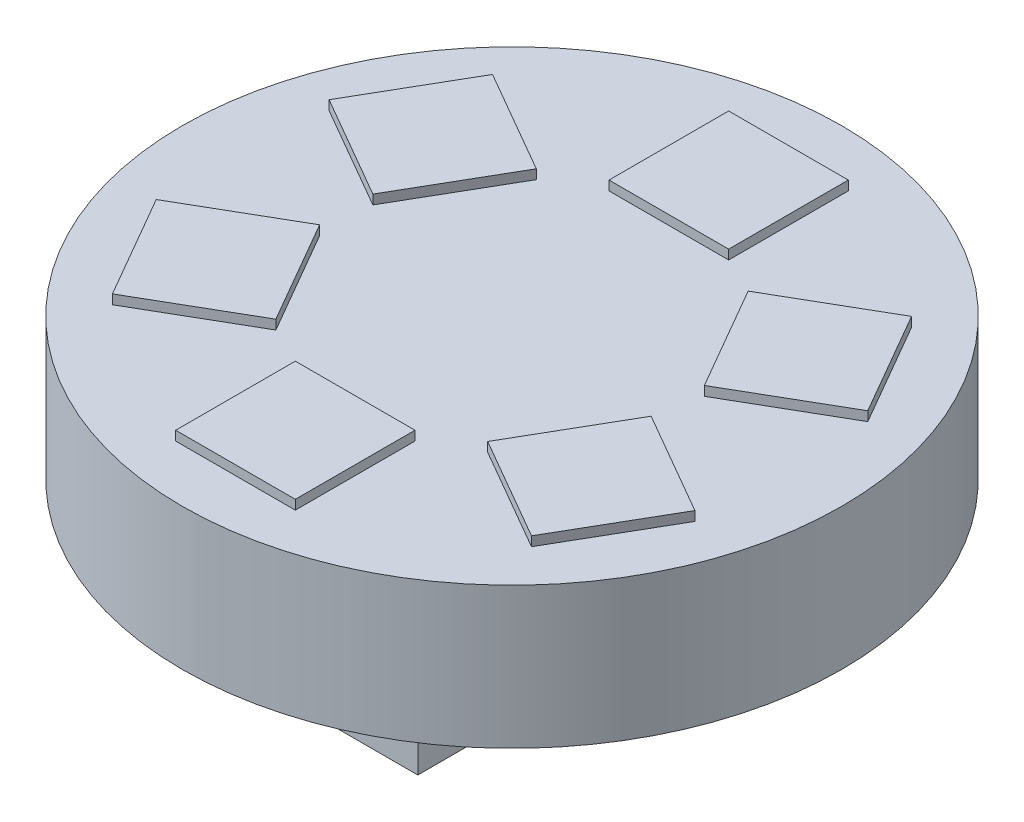
ISO-10303-21;
HEADER;
FILE_DESCRIPTION(('STEP AP214'),'2;1');
FILE_NAME('part.step','',(''),(''),'','','');
FILE_SCHEMA(('AUTOMOTIVE_DESIGN { 1 0 10303 214 1 1 1 1 }'));
ENDSEC;
DATA;
#1=APPLICATION_CONTEXT('core data for automotive mechanical design processes');
#2=APPLICATION_PROTOCOL_DEFINITION('international standard','automotive_design',2000,#1);
#3=PRODUCT_CONTEXT('',#1,'mechanical');
#4=PRODUCT('Part','Part','',(#3));
#5=PRODUCT_RELATED_PRODUCT_CATEGORY('part','',(#4));
#6=PRODUCT_DEFINITION_FORMATION('','',#4);
#7=PRODUCT_DEFINITION_CONTEXT('part definition',#1,'design');
#8=PRODUCT_DEFINITION('design','',#6,#7);
#9=PRODUCT_DEFINITION_SHAPE('','',#8);
#10=(LENGTH_UNIT() NAMED_UNIT(*) SI_UNIT(.MILLI.,.METRE.));
#11=(NAMED_UNIT(*) PLANE_ANGLE_UNIT() SI_UNIT($,.RADIAN.));
#12=(NAMED_UNIT(*) SI_UNIT($,.STERADIAN.) SOLID_ANGLE_UNIT());
#13=UNCERTAINTY_MEASURE_WITH_UNIT(LENGTH_MEASURE(1.E-05),#10,'distance_accuracy_value','');
#14=(GEOMETRIC_REPRESENTATION_CONTEXT(3) GLOBAL_UNCERTAINTY_ASSIGNED_CONTEXT((#13)) GLOBAL_UNIT_ASSIGNED_CONTEXT((#10,
#11,#12)) REPRESENTATION_CONTEXT('',''));
#15=CARTESIAN_POINT('',(0.,0.,0.));
#16=DIRECTION('',(0.,0.,1.));
#17=DIRECTION('',(1.,0.,0.));
#18=AXIS2_PLACEMENT_3D('',#15,#16,#17);
#19=CARTESIAN_POINT('',(0.,1.5,0.));
#20=DIRECTION('',(0.,1.,0.));
#21=DIRECTION('',(0.,0.,1.));
#22=AXIS2_PLACEMENT_3D('',#19,#20,#21);
#23=PLANE('',#22);
#24=DIRECTION('',(0.499999999999999,0.,-0.866025403784439));
#25=VECTOR('',#24,1.);
#26=CARTESIAN_POINT('',(-2.85928456010733,1.5,-0.917573868596879));
#27=LINE('',#26,#25);
#28=CARTESIAN_POINT('',(-2.85928456010733,1.5,-0.917573868596879));
#29=VERTEX_POINT('',#28);
#30=CARTESIAN_POINT('',(-2.22428456010733,1.5,-2.01742613140312));
#31=VERTEX_POINT('',#30);
#32=EDGE_CURVE('E223',#29,#31,#27,.T.);
#33=ORIENTED_EDGE('',*,*,#32,.T.);
#34=DIRECTION('',(0.866025403784439,0.,0.499999999999999));
#35=VECTOR('',#34,1.);
#36=CARTESIAN_POINT('',(-2.22428456010733,1.5,-2.01742613140312));
#37=LINE('',#36,#35);
#38=CARTESIAN_POINT('',(-1.12443229730109,1.5,-1.38242613140312));
#39=VERTEX_POINT('',#38);
#40=EDGE_CURVE('E227',#31,#39,#37,.T.);
#41=ORIENTED_EDGE('',*,*,#40,.T.);
#42=DIRECTION('',(0.499999999999999,0.,-0.866025403784439));
#43=VECTOR('',#42,1.);
#44=CARTESIAN_POINT('',(-1.75943229730109,1.5,-0.28257386859688));
#45=LINE('',#44,#43);
#46=CARTESIAN_POINT('',(-1.75943229730109,1.5,-0.28257386859688));
#47=VERTEX_POINT('',#46);
#48=EDGE_CURVE('E62',#47,#39,#45,.T.);
#49=ORIENTED_EDGE('',*,*,#48,.F.);
#50=DIRECTION('',(0.866025403784439,0.,0.499999999999999));
#51=VECTOR('',#50,1.);
#52=CARTESIAN_POINT('',(-2.85928456010733,1.5,-0.917573868596879));
#53=LINE('',#52,#51);
#54=EDGE_CURVE('E57',#29,#47,#53,.T.);
#55=ORIENTED_EDGE('',*,*,#54,.F.);
#56=EDGE_LOOP('',(#33,#41,#49,#55));
#57=FACE_BOUND('',#56,.T.);
#58=DIRECTION('',(0.,0.,1.));
#59=VECTOR('',#58,1.);
#60=CARTESIAN_POINT('',(0.635,1.5,0.));
#61=LINE('',#60,#59);
#62=CARTESIAN_POINT('',(0.635,1.5,-2.935));
#63=VERTEX_POINT('',#62);
#64=CARTESIAN_POINT('',(0.635,1.5,-1.665));
#65=VERTEX_POINT('',#64);
#66=EDGE_CURVE('E429',#63,#65,#61,.T.);
#67=ORIENTED_EDGE('',*,*,#66,.T.);
#68=DIRECTION('',(1.,0.,0.));
#69=VECTOR('',#68,1.);
#70=CARTESIAN_POINT('',(0.,1.5,-1.665));
#71=LINE('',#70,#69);
#72=CARTESIAN_POINT('',(-0.635,1.5,-1.665));
#73=VERTEX_POINT('',#72);
#74=EDGE_CURVE('E448',#73,#65,#71,.T.);
#75=ORIENTED_EDGE('',*,*,#74,.F.);
#76=DIRECTION('',(0.,0.,1.));
#77=VECTOR('',#76,1.);
#78=CARTESIAN_POINT('',(-0.635,1.5,0.));
#79=LINE('',#78,#77);
#80=CARTESIAN_POINT('',(-0.635,1.5,-2.935));
#81=VERTEX_POINT('',#80);
#82=EDGE_CURVE('E466',#81,#73,#79,.T.);
#83=ORIENTED_EDGE('',*,*,#82,.F.);
#84=DIRECTION('',(1.,0.,0.));
#85=VECTOR('',#84,1.);
#86=CARTESIAN_POINT('',(0.,1.5,-2.935));
#87=LINE('',#86,#85);
#88=EDGE_CURVE('E462',#81,#63,#87,.T.);
#89=ORIENTED_EDGE('',*,*,#88,.T.);
#90=EDGE_LOOP('',(#67,#75,#83,#89));
#91=FACE_BOUND('',#90,.T.);
#92=CARTESIAN_POINT('',(0.,1.5,0.));
#93=DIRECTION('',(0.,1.,0.));
#94=DIRECTION('',(0.,0.,1.));
#95=AXIS2_PLACEMENT_3D('',#92,#93,#94);
#96=CIRCLE('',#95,3.5);
#97=CARTESIAN_POINT('',(0.,1.5,3.5));
#98=VERTEX_POINT('',#97);
#99=EDGE_CURVE('E11',#98,#98,#96,.T.);
#100=ORIENTED_EDGE('',*,*,#99,.T.);
#101=EDGE_LOOP('',(#100));
#102=FACE_BOUND('',#101,.T.);
#103=DIRECTION('',(0.5,0.,0.866025403784439));
#104=VECTOR('',#103,1.);
#105=CARTESIAN_POINT('',(1.44193229730109,1.5,-0.8325));
#106=LINE('',#105,#104);
#107=CARTESIAN_POINT('',(1.12443229730109,1.5,-1.38242613140312));
#108=VERTEX_POINT('',#107);
#109=CARTESIAN_POINT('',(1.75943229730109,1.5,-0.282573868596882));
#110=VERTEX_POINT('',#109);
#111=EDGE_CURVE('E421',#108,#110,#106,.T.);
#112=ORIENTED_EDGE('',*,*,#111,.F.);
#113=DIRECTION('',(-0.866025403784438,0.,0.5));
#114=VECTOR('',#113,1.);
#115=CARTESIAN_POINT('',(-0.3175,1.5,-0.549926131403118));
#116=LINE('',#115,#114);
#117=CARTESIAN_POINT('',(2.22428456010733,1.5,-2.01742613140312));
#118=VERTEX_POINT('',#117);
#119=EDGE_CURVE('E425',#118,#108,#116,.T.);
#120=ORIENTED_EDGE('',*,*,#119,.F.);
#121=DIRECTION('',(0.5,0.,0.866025403784439));
#122=VECTOR('',#121,1.);
#123=CARTESIAN_POINT('',(2.54178456010733,1.5,-1.4675));
#124=LINE('',#123,#122);
#125=CARTESIAN_POINT('',(2.85928456010733,1.5,-0.917573868596882));
#126=VERTEX_POINT('',#125);
#127=EDGE_CURVE('E414',#118,#126,#124,.T.);
#128=ORIENTED_EDGE('',*,*,#127,.T.);
#129=DIRECTION('',(-0.866025403784439,0.,0.5));
#130=VECTOR('',#129,1.);
#131=CARTESIAN_POINT('',(0.3175,1.5,0.549926131403118));
#132=LINE('',#131,#130);
#133=EDGE_CURVE('E417',#126,#110,#132,.T.);
#134=ORIENTED_EDGE('',*,*,#133,.T.);
#135=EDGE_LOOP('',(#112,#120,#128,#134));
#136=FACE_BOUND('',#135,.T.);
#137=DIRECTION('',(-0.5,0.,0.866025403784439));
#138=VECTOR('',#137,1.);
#139=CARTESIAN_POINT('',(1.44193229730109,1.5,0.8325));
#140=LINE('',#139,#138);
#141=CARTESIAN_POINT('',(1.75943229730109,1.5,0.282573868596881));
#142=VERTEX_POINT('',#141);
#143=CARTESIAN_POINT('',(1.12443229730109,1.5,1.38242613140312));
#144=VERTEX_POINT('',#143);
#145=EDGE_CURVE('E376',#142,#144,#140,.T.);
#146=ORIENTED_EDGE('',*,*,#145,.F.);
#147=DIRECTION('',(-0.866025403784439,0.,-0.5));
#148=VECTOR('',#147,1.);
#149=CARTESIAN_POINT('',(0.3175,1.5,-0.549926131403119));
#150=LINE('',#149,#148);
#151=CARTESIAN_POINT('',(2.85928456010733,1.5,0.917573868596881));
#152=VERTEX_POINT('',#151);
#153=EDGE_CURVE('E380',#152,#142,#150,.T.);
#154=ORIENTED_EDGE('',*,*,#153,.F.);
#155=DIRECTION('',(-0.5,0.,0.866025403784439));
#156=VECTOR('',#155,1.);
#157=CARTESIAN_POINT('',(2.54178456010733,1.5,1.4675));
#158=LINE('',#157,#156);
#159=CARTESIAN_POINT('',(2.22428456010733,1.5,2.01742613140312));
#160=VERTEX_POINT('',#159);
#161=EDGE_CURVE('E369',#152,#160,#158,.T.);
#162=ORIENTED_EDGE('',*,*,#161,.T.);
#163=DIRECTION('',(-0.866025403784439,0.,-0.5));
#164=VECTOR('',#163,1.);
#165=CARTESIAN_POINT('',(-0.3175,1.5,0.549926131403119));
#166=LINE('',#165,#164);
#167=EDGE_CURVE('E372',#160,#144,#166,.T.);
#168=ORIENTED_EDGE('',*,*,#167,.T.);
#169=EDGE_LOOP('',(#146,#154,#162,#168));
#170=FACE_BOUND('',#169,.T.);
#171=DIRECTION('',(-1.,0.,0.));
#172=VECTOR('',#171,1.);
#173=CARTESIAN_POINT('',(0.,1.5,1.665));
#174=LINE('',#173,#172);
#175=CARTESIAN_POINT('',(0.635,1.5,1.665));
#176=VERTEX_POINT('',#175);
#177=CARTESIAN_POINT('',(-0.635,1.5,1.665));
#178=VERTEX_POINT('',#177);
#179=EDGE_CURVE('E331',#176,#178,#174,.T.);
#180=ORIENTED_EDGE('',*,*,#179,.F.);
#181=DIRECTION('',(0.,0.,-1.));
#182=VECTOR('',#181,1.);
#183=CARTESIAN_POINT('',(0.635,1.5,0.));
#184=LINE('',#183,#182);
#185=CARTESIAN_POINT('',(0.635000000000001,1.5,2.935));
#186=VERTEX_POINT('',#185);
#187=EDGE_CURVE('E335',#186,#176,#184,.T.);
#188=ORIENTED_EDGE('',*,*,#187,.F.);
#189=DIRECTION('',(-1.,0.,0.));
#190=VECTOR('',#189,1.);
#191=CARTESIAN_POINT('',(0.,1.5,2.935));
#192=LINE('',#191,#190);
#193=CARTESIAN_POINT('',(-0.635,1.5,2.935));
#194=VERTEX_POINT('',#193);
#195=EDGE_CURVE('E324',#186,#194,#192,.T.);
#196=ORIENTED_EDGE('',*,*,#195,.T.);
#197=DIRECTION('',(0.,0.,-1.));
#198=VECTOR('',#197,1.);
#199=CARTESIAN_POINT('',(-0.635,1.5,0.));
#200=LINE('',#199,#198);
#201=EDGE_CURVE('E327',#194,#178,#200,.T.);
#202=ORIENTED_EDGE('',*,*,#201,.T.);
#203=EDGE_LOOP('',(#180,#188,#196,#202));
#204=FACE_BOUND('',#203,.T.);
#205=DIRECTION('',(-0.5,0.,-0.866025403784438));
#206=VECTOR('',#205,1.);
#207=CARTESIAN_POINT('',(-1.44193229730109,1.5,0.832500000000001));
#208=LINE('',#207,#206);
#209=CARTESIAN_POINT('',(-1.12443229730109,1.5,1.38242613140312));
#210=VERTEX_POINT('',#209);
#211=CARTESIAN_POINT('',(-1.75943229730109,1.5,0.282573868596883));
#212=VERTEX_POINT('',#211);
#213=EDGE_CURVE('E286',#210,#212,#208,.T.);
#214=ORIENTED_EDGE('',*,*,#213,.F.);
#215=DIRECTION('',(0.866025403784438,0.,-0.500000000000001));
#216=VECTOR('',#215,1.);
#217=CARTESIAN_POINT('',(0.3175,1.5,0.549926131403118));
#218=LINE('',#217,#216);
#219=CARTESIAN_POINT('',(-2.22428456010733,1.5,2.01742613140312));
#220=VERTEX_POINT('',#219);
#221=EDGE_CURVE('E290',#220,#210,#218,.T.);
#222=ORIENTED_EDGE('',*,*,#221,.F.);
#223=DIRECTION('',(-0.5,0.,-0.866025403784439));
#224=VECTOR('',#223,1.);
#225=CARTESIAN_POINT('',(-2.54178456010733,1.5,1.4675));
#226=LINE('',#225,#224);
#227=CARTESIAN_POINT('',(-2.85928456010733,1.5,0.917573868596883));
#228=VERTEX_POINT('',#227);
#229=EDGE_CURVE('E279',#220,#228,#226,.T.);
#230=ORIENTED_EDGE('',*,*,#229,.T.);
#231=DIRECTION('',(0.866025403784438,0.,-0.5));
#232=VECTOR('',#231,1.);
#233=CARTESIAN_POINT('',(-0.3175,1.5,-0.549926131403118));
#234=LINE('',#233,#232);
#235=EDGE_CURVE('E282',#228,#212,#234,.T.);
#236=ORIENTED_EDGE('',*,*,#235,.T.);
#237=EDGE_LOOP('',(#214,#222,#230,#236));
#238=FACE_BOUND('',#237,.T.);
#239=ADVANCED_FACE('F41',(#57,#91,#102,#136,#170,#204,#238),#23,.T.);
#240=CARTESIAN_POINT('',(0.,0.,0.));
#241=DIRECTION('',(0.,1.,0.));
#242=DIRECTION('',(0.,0.,1.));
#243=AXIS2_PLACEMENT_3D('',#240,#241,#242);
#244=PLANE('',#243);
#245=CARTESIAN_POINT('',(0.,0.,0.));
#246=DIRECTION('',(0.,1.,0.));
#247=DIRECTION('',(0.,0.,1.));
#248=AXIS2_PLACEMENT_3D('',#245,#246,#247);
#249=CIRCLE('',#248,3.5);
#250=CARTESIAN_POINT('',(0.,0.,3.5));
#251=VERTEX_POINT('',#250);
#252=EDGE_CURVE('E45',#251,#251,#249,.T.);
#253=ORIENTED_EDGE('',*,*,#252,.F.);
#254=EDGE_LOOP('',(#253));
#255=FACE_BOUND('',#254,.T.);
#256=DIRECTION('',(0.,0.,1.));
#257=VECTOR('',#256,1.);
#258=CARTESIAN_POINT('',(1.22,0.,0.));
#259=LINE('',#258,#257);
#260=CARTESIAN_POINT('',(1.22,0.,-2.22));
#261=VERTEX_POINT('',#260);
#262=CARTESIAN_POINT('',(1.22,0.,2.22));
#263=VERTEX_POINT('',#262);
#264=EDGE_CURVE('E484',#261,#263,#259,.T.);
#265=ORIENTED_EDGE('',*,*,#264,.F.);
#266=DIRECTION('',(1.,0.,0.));
#267=VECTOR('',#266,1.);
#268=CARTESIAN_POINT('',(0.,0.,-2.22));
#269=LINE('',#268,#267);
#270=CARTESIAN_POINT('',(-1.22,0.,-2.22));
#271=VERTEX_POINT('',#270);
#272=EDGE_CURVE('E503',#271,#261,#269,.T.);
#273=ORIENTED_EDGE('',*,*,#272,.F.);
#274=DIRECTION('',(0.,0.,1.));
#275=VECTOR('',#274,1.);
#276=CARTESIAN_POINT('',(-1.22,0.,0.));
#277=LINE('',#276,#275);
#278=CARTESIAN_POINT('',(-1.22,0.,2.22));
#279=VERTEX_POINT('',#278);
#280=EDGE_CURVE('E506',#271,#279,#277,.T.);
#281=ORIENTED_EDGE('',*,*,#280,.T.);
#282=DIRECTION('',(1.,0.,0.));
#283=VECTOR('',#282,1.);
#284=CARTESIAN_POINT('',(0.,0.,2.22));
#285=LINE('',#284,#283);
#286=EDGE_CURVE('E489',#279,#263,#285,.T.);
#287=ORIENTED_EDGE('',*,*,#286,.T.);
#288=EDGE_LOOP('',(#265,#273,#281,#287));
#289=FACE_BOUND('',#288,.T.);
#290=ADVANCED_FACE('F535',(#255,#289),#244,.F.);
#291=CARTESIAN_POINT('',(0.,1.5,0.));
#292=DIRECTION('',(0.,-1.,0.));
#293=DIRECTION('',(0.,0.,-1.));
#294=AXIS2_PLACEMENT_3D('',#291,#292,#293);
#295=CYLINDRICAL_SURFACE('',#294,3.5);
#296=ORIENTED_EDGE('',*,*,#99,.F.);
#297=EDGE_LOOP('',(#296));
#298=FACE_BOUND('',#297,.T.);
#299=ORIENTED_EDGE('',*,*,#252,.T.);
#300=EDGE_LOOP('',(#299));
#301=FACE_BOUND('',#300,.T.);
#302=ADVANCED_FACE('F43',(#298,#301),#295,.T.);
#303=CARTESIAN_POINT('',(1.22,-1.,0.));
#304=DIRECTION('',(-1.,0.,0.));
#305=DIRECTION('',(0.,0.,1.));
#306=AXIS2_PLACEMENT_3D('',#303,#304,#305);
#307=PLANE('',#306);
#308=ORIENTED_EDGE('',*,*,#264,.T.);
#309=DIRECTION('',(0.,1.,0.));
#310=VECTOR('',#309,1.);
#311=CARTESIAN_POINT('',(1.22,-1.,2.22));
#312=LINE('',#311,#310);
#313=CARTESIAN_POINT('',(1.22,-1.,2.22));
#314=VERTEX_POINT('',#313);
#315=EDGE_CURVE('E513',#314,#263,#312,.T.);
#316=ORIENTED_EDGE('',*,*,#315,.F.);
#317=DIRECTION('',(0.,0.,1.));
#318=VECTOR('',#317,1.);
#319=CARTESIAN_POINT('',(1.22,-1.,0.));
#320=LINE('',#319,#318);
#321=CARTESIAN_POINT('',(1.22,-1.,-2.22));
#322=VERTEX_POINT('',#321);
#323=EDGE_CURVE('E485',#322,#314,#320,.T.);
#324=ORIENTED_EDGE('',*,*,#323,.F.);
#325=DIRECTION('',(0.,1.,0.));
#326=VECTOR('',#325,1.);
#327=CARTESIAN_POINT('',(1.22,-1.,-2.22));
#328=LINE('',#327,#326);
#329=EDGE_CURVE('E500',#322,#261,#328,.T.);
#330=ORIENTED_EDGE('',*,*,#329,.T.);
#331=EDGE_LOOP('',(#308,#316,#324,#330));
#332=FACE_BOUND('',#331,.T.);
#333=ADVANCED_FACE('F529',(#332),#307,.F.);
#334=CARTESIAN_POINT('',(0.,-1.,2.22));
#335=DIRECTION('',(0.,0.,1.));
#336=DIRECTION('',(1.,0.,0.));
#337=AXIS2_PLACEMENT_3D('',#334,#335,#336);
#338=PLANE('',#337);
#339=ORIENTED_EDGE('',*,*,#286,.F.);
#340=DIRECTION('',(0.,1.,0.));
#341=VECTOR('',#340,1.);
#342=CARTESIAN_POINT('',(-1.22,-1.,2.22));
#343=LINE('',#342,#341);
#344=CARTESIAN_POINT('',(-1.22,-1.,2.22));
#345=VERTEX_POINT('',#344);
#346=EDGE_CURVE('E517',#345,#279,#343,.T.);
#347=ORIENTED_EDGE('',*,*,#346,.F.);
#348=DIRECTION('',(1.,0.,0.));
#349=VECTOR('',#348,1.);
#350=CARTESIAN_POINT('',(0.,-1.,2.22));
#351=LINE('',#350,#349);
#352=EDGE_CURVE('E496',#345,#314,#351,.T.);
#353=ORIENTED_EDGE('',*,*,#352,.T.);
#354=ORIENTED_EDGE('',*,*,#315,.T.);
#355=EDGE_LOOP('',(#339,#347,#353,#354));
#356=FACE_BOUND('',#355,.T.);
#357=ADVANCED_FACE('F539',(#356),#338,.T.);
#358=CARTESIAN_POINT('',(-1.22,-1.,0.));
#359=DIRECTION('',(-1.,0.,0.));
#360=DIRECTION('',(0.,0.,1.));
#361=AXIS2_PLACEMENT_3D('',#358,#359,#360);
#362=PLANE('',#361);
#363=ORIENTED_EDGE('',*,*,#280,.F.);
#364=DIRECTION('',(0.,1.,0.));
#365=VECTOR('',#364,1.);
#366=CARTESIAN_POINT('',(-1.22,-1.,-2.22));
#367=LINE('',#366,#365);
#368=CARTESIAN_POINT('',(-1.22,-1.,-2.22));
#369=VERTEX_POINT('',#368);
#370=EDGE_CURVE('E520',#369,#271,#367,.T.);
#371=ORIENTED_EDGE('',*,*,#370,.F.);
#372=DIRECTION('',(0.,0.,1.));
#373=VECTOR('',#372,1.);
#374=CARTESIAN_POINT('',(-1.22,-1.,0.));
#375=LINE('',#374,#373);
#376=EDGE_CURVE('E492',#369,#345,#375,.T.);
#377=ORIENTED_EDGE('',*,*,#376,.T.);
#378=ORIENTED_EDGE('',*,*,#346,.T.);
#379=EDGE_LOOP('',(#363,#371,#377,#378));
#380=FACE_BOUND('',#379,.T.);
#381=ADVANCED_FACE('F546',(#380),#362,.T.);
#382=CARTESIAN_POINT('',(0.,-1.,-2.22));
#383=DIRECTION('',(0.,0.,1.));
#384=DIRECTION('',(1.,0.,0.));
#385=AXIS2_PLACEMENT_3D('',#382,#383,#384);
#386=PLANE('',#385);
#387=ORIENTED_EDGE('',*,*,#272,.T.);
#388=ORIENTED_EDGE('',*,*,#329,.F.);
#389=DIRECTION('',(1.,0.,0.));
#390=VECTOR('',#389,1.);
#391=CARTESIAN_POINT('',(0.,-1.,-2.22));
#392=LINE('',#391,#390);
#393=EDGE_CURVE('E488',#369,#322,#392,.T.);
#394=ORIENTED_EDGE('',*,*,#393,.F.);
#395=ORIENTED_EDGE('',*,*,#370,.T.);
#396=EDGE_LOOP('',(#387,#388,#394,#395));
#397=FACE_BOUND('',#396,.T.);
#398=ADVANCED_FACE('F544',(#397),#386,.F.);
#399=CARTESIAN_POINT('',(0.,-1.,0.));
#400=DIRECTION('',(0.,1.,0.));
#401=DIRECTION('',(0.,0.,1.));
#402=AXIS2_PLACEMENT_3D('',#399,#400,#401);
#403=PLANE('',#402);
#404=ORIENTED_EDGE('',*,*,#323,.T.);
#405=ORIENTED_EDGE('',*,*,#352,.F.);
#406=ORIENTED_EDGE('',*,*,#376,.F.);
#407=ORIENTED_EDGE('',*,*,#393,.T.);
#408=EDGE_LOOP('',(#404,#405,#406,#407));
#409=FACE_BOUND('',#408,.T.);
#410=ADVANCED_FACE('F543',(#409),#403,.F.);
#411=CARTESIAN_POINT('',(0.635,1.6,0.));
#412=DIRECTION('',(1.,0.,0.));
#413=DIRECTION('',(0.,0.,-1.));
#414=AXIS2_PLACEMENT_3D('',#411,#412,#413);
#415=PLANE('',#414);
#416=ORIENTED_EDGE('',*,*,#66,.F.);
#417=DIRECTION('',(0.,-1.,0.));
#418=VECTOR('',#417,1.);
#419=CARTESIAN_POINT('',(0.635,1.6,-2.935));
#420=LINE('',#419,#418);
#421=CARTESIAN_POINT('',(0.635,1.6,-2.935));
#422=VERTEX_POINT('',#421);
#423=EDGE_CURVE('E481',#422,#63,#420,.T.);
#424=ORIENTED_EDGE('',*,*,#423,.F.);
#425=DIRECTION('',(0.,0.,1.));
#426=VECTOR('',#425,1.);
#427=CARTESIAN_POINT('',(0.635,1.6,0.));
#428=LINE('',#427,#426);
#429=CARTESIAN_POINT('',(0.635,1.6,-1.665));
#430=VERTEX_POINT('',#429);
#431=EDGE_CURVE('E443',#422,#430,#428,.T.);
#432=ORIENTED_EDGE('',*,*,#431,.T.);
#433=DIRECTION('',(0.,-1.,0.));
#434=VECTOR('',#433,1.);
#435=CARTESIAN_POINT('',(0.635,1.6,-1.665));
#436=LINE('',#435,#434);
#437=EDGE_CURVE('E458',#430,#65,#436,.T.);
#438=ORIENTED_EDGE('',*,*,#437,.T.);
#439=EDGE_LOOP('',(#416,#424,#432,#438));
#440=FACE_BOUND('',#439,.T.);
#441=ADVANCED_FACE('F682',(#440),#415,.T.);
#442=CARTESIAN_POINT('',(0.,1.6,-2.935));
#443=DIRECTION('',(0.,0.,-1.));
#444=DIRECTION('',(-1.,0.,0.));
#445=AXIS2_PLACEMENT_3D('',#442,#443,#444);
#446=PLANE('',#445);
#447=ORIENTED_EDGE('',*,*,#88,.F.);
#448=DIRECTION('',(0.,-1.,0.));
#449=VECTOR('',#448,1.);
#450=CARTESIAN_POINT('',(-0.635,1.6,-2.935));
#451=LINE('',#450,#449);
#452=CARTESIAN_POINT('',(-0.635,1.6,-2.935));
#453=VERTEX_POINT('',#452);
#454=EDGE_CURVE('E478',#453,#81,#451,.T.);
#455=ORIENTED_EDGE('',*,*,#454,.F.);
#456=DIRECTION('',(1.,0.,0.));
#457=VECTOR('',#456,1.);
#458=CARTESIAN_POINT('',(0.,1.6,-2.935));
#459=LINE('',#458,#457);
#460=EDGE_CURVE('E447',#453,#422,#459,.T.);
#461=ORIENTED_EDGE('',*,*,#460,.T.);
#462=ORIENTED_EDGE('',*,*,#423,.T.);
#463=EDGE_LOOP('',(#447,#455,#461,#462));
#464=FACE_BOUND('',#463,.T.);
#465=ADVANCED_FACE('F678',(#464),#446,.T.);
#466=CARTESIAN_POINT('',(-0.635,1.6,0.));
#467=DIRECTION('',(1.,0.,0.));
#468=DIRECTION('',(0.,0.,-1.));
#469=AXIS2_PLACEMENT_3D('',#466,#467,#468);
#470=PLANE('',#469);
#471=ORIENTED_EDGE('',*,*,#82,.T.);
#472=DIRECTION('',(0.,-1.,0.));
#473=VECTOR('',#472,1.);
#474=CARTESIAN_POINT('',(-0.635,1.6,-1.665));
#475=LINE('',#474,#473);
#476=CARTESIAN_POINT('',(-0.635,1.6,-1.665));
#477=VERTEX_POINT('',#476);
#478=EDGE_CURVE('E475',#477,#73,#475,.T.);
#479=ORIENTED_EDGE('',*,*,#478,.F.);
#480=DIRECTION('',(0.,0.,1.));
#481=VECTOR('',#480,1.);
#482=CARTESIAN_POINT('',(-0.635,1.6,0.));
#483=LINE('',#482,#481);
#484=EDGE_CURVE('E452',#453,#477,#483,.T.);
#485=ORIENTED_EDGE('',*,*,#484,.F.);
#486=ORIENTED_EDGE('',*,*,#454,.T.);
#487=EDGE_LOOP('',(#471,#479,#485,#486));
#488=FACE_BOUND('',#487,.T.);
#489=ADVANCED_FACE('F674',(#488),#470,.F.);
#490=CARTESIAN_POINT('',(0.,1.6,-1.665));
#491=DIRECTION('',(0.,0.,-1.));
#492=DIRECTION('',(-1.,0.,0.));
#493=AXIS2_PLACEMENT_3D('',#490,#491,#492);
#494=PLANE('',#493);
#495=ORIENTED_EDGE('',*,*,#74,.T.);
#496=ORIENTED_EDGE('',*,*,#437,.F.);
#497=DIRECTION('',(1.,0.,0.));
#498=VECTOR('',#497,1.);
#499=CARTESIAN_POINT('',(0.,1.6,-1.665));
#500=LINE('',#499,#498);
#501=EDGE_CURVE('E455',#477,#430,#500,.T.);
#502=ORIENTED_EDGE('',*,*,#501,.F.);
#503=ORIENTED_EDGE('',*,*,#478,.T.);
#504=EDGE_LOOP('',(#495,#496,#502,#503));
#505=FACE_BOUND('',#504,.T.);
#506=ADVANCED_FACE('F670',(#505),#494,.F.);
#507=CARTESIAN_POINT('',(0.,1.6,0.));
#508=DIRECTION('',(0.,1.,0.));
#509=DIRECTION('',(0.,0.,1.));
#510=AXIS2_PLACEMENT_3D('',#507,#508,#509);
#511=PLANE('',#510);
#512=ORIENTED_EDGE('',*,*,#431,.F.);
#513=ORIENTED_EDGE('',*,*,#460,.F.);
#514=ORIENTED_EDGE('',*,*,#484,.T.);
#515=ORIENTED_EDGE('',*,*,#501,.T.);
#516=EDGE_LOOP('',(#512,#513,#514,#515));
#517=FACE_BOUND('',#516,.T.);
#518=ADVANCED_FACE('F652',(#517),#511,.T.);
#519=CARTESIAN_POINT('',(-0.3175,1.6,-0.549926131403118));
#520=DIRECTION('',(0.5,0.,0.866025403784438));
#521=DIRECTION('',(0.866025403784438,0.,-0.5));
#522=AXIS2_PLACEMENT_3D('',#519,#520,#521);
#523=PLANE('',#522);
#524=ORIENTED_EDGE('',*,*,#119,.T.);
#525=DIRECTION('',(0.,-1.,0.));
#526=VECTOR('',#525,1.);
#527=CARTESIAN_POINT('',(1.12443229730109,1.6,-1.38242613140312));
#528=LINE('',#527,#526);
#529=CARTESIAN_POINT('',(1.12443229730109,1.6,-1.38242613140312));
#530=VERTEX_POINT('',#529);
#531=EDGE_CURVE('E384',#530,#108,#528,.T.);
#532=ORIENTED_EDGE('',*,*,#531,.F.);
#533=DIRECTION('',(-0.866025403784438,0.,0.5));
#534=VECTOR('',#533,1.);
#535=CARTESIAN_POINT('',(-0.3175,1.6,-0.549926131403118));
#536=LINE('',#535,#534);
#537=CARTESIAN_POINT('',(2.22428456010733,1.6,-2.01742613140312));
#538=VERTEX_POINT('',#537);
#539=EDGE_CURVE('E418',#538,#530,#536,.T.);
#540=ORIENTED_EDGE('',*,*,#539,.F.);
#541=DIRECTION('',(0.,-1.,0.));
#542=VECTOR('',#541,1.);
#543=CARTESIAN_POINT('',(2.22428456010733,1.6,-2.01742613140312));
#544=LINE('',#543,#542);
#545=EDGE_CURVE('E409',#538,#118,#544,.T.);
#546=ORIENTED_EDGE('',*,*,#545,.T.);
#547=EDGE_LOOP('',(#524,#532,#540,#546));
#548=FACE_BOUND('',#547,.T.);
#549=ADVANCED_FACE('F648',(#548),#523,.F.);
#550=CARTESIAN_POINT('',(1.44193229730109,1.6,-0.8325));
#551=DIRECTION('',(0.866025403784439,0.,-0.5));
#552=DIRECTION('',(-0.5,0.,-0.866025403784439));
#553=AXIS2_PLACEMENT_3D('',#550,#551,#552);
#554=PLANE('',#553);
#555=ORIENTED_EDGE('',*,*,#111,.T.);
#556=DIRECTION('',(0.,-1.,0.));
#557=VECTOR('',#556,1.);
#558=CARTESIAN_POINT('',(1.75943229730109,1.6,-0.282573868596882));
#559=LINE('',#558,#557);
#560=CARTESIAN_POINT('',(1.75943229730109,1.6,-0.282573868596882));
#561=VERTEX_POINT('',#560);
#562=EDGE_CURVE('E401',#561,#110,#559,.T.);
#563=ORIENTED_EDGE('',*,*,#562,.F.);
#564=DIRECTION('',(0.5,0.,0.866025403784439));
#565=VECTOR('',#564,1.);
#566=CARTESIAN_POINT('',(1.44193229730109,1.6,-0.8325));
#567=LINE('',#566,#565);
#568=EDGE_CURVE('E437',#530,#561,#567,.T.);
#569=ORIENTED_EDGE('',*,*,#568,.F.);
#570=ORIENTED_EDGE('',*,*,#531,.T.);
#571=EDGE_LOOP('',(#555,#563,#569,#570));
#572=FACE_BOUND('',#571,.T.);
#573=ADVANCED_FACE('F651',(#572),#554,.F.);
#574=CARTESIAN_POINT('',(0.3175,1.6,0.549926131403118));
#575=DIRECTION('',(0.5,0.,0.866025403784439));
#576=DIRECTION('',(0.866025403784439,0.,-0.5));
#577=AXIS2_PLACEMENT_3D('',#574,#575,#576);
#578=PLANE('',#577);
#579=ORIENTED_EDGE('',*,*,#133,.F.);
#580=DIRECTION('',(0.,-1.,0.));
#581=VECTOR('',#580,1.);
#582=CARTESIAN_POINT('',(2.85928456010733,1.6,-0.917573868596882));
#583=LINE('',#582,#581);
#584=CARTESIAN_POINT('',(2.85928456010733,1.6,-0.917573868596882));
#585=VERTEX_POINT('',#584);
#586=EDGE_CURVE('E405',#585,#126,#583,.T.);
#587=ORIENTED_EDGE('',*,*,#586,.F.);
#588=DIRECTION('',(-0.866025403784439,0.,0.5));
#589=VECTOR('',#588,1.);
#590=CARTESIAN_POINT('',(0.3175,1.6,0.549926131403118));
#591=LINE('',#590,#589);
#592=EDGE_CURVE('E433',#585,#561,#591,.T.);
#593=ORIENTED_EDGE('',*,*,#592,.T.);
#594=ORIENTED_EDGE('',*,*,#562,.T.);
#595=EDGE_LOOP('',(#579,#587,#593,#594));
#596=FACE_BOUND('',#595,.T.);
#597=ADVANCED_FACE('F656',(#596),#578,.T.);
#598=CARTESIAN_POINT('',(2.54178456010733,1.6,-1.4675));
#599=DIRECTION('',(0.866025403784439,0.,-0.5));
#600=DIRECTION('',(-0.5,0.,-0.866025403784439));
#601=AXIS2_PLACEMENT_3D('',#598,#599,#600);
#602=PLANE('',#601);
#603=ORIENTED_EDGE('',*,*,#127,.F.);
#604=ORIENTED_EDGE('',*,*,#545,.F.);
#605=DIRECTION('',(0.5,0.,0.866025403784439));
#606=VECTOR('',#605,1.);
#607=CARTESIAN_POINT('',(2.54178456010733,1.6,-1.4675));
#608=LINE('',#607,#606);
#609=EDGE_CURVE('E413',#538,#585,#608,.T.);
#610=ORIENTED_EDGE('',*,*,#609,.T.);
#611=ORIENTED_EDGE('',*,*,#586,.T.);
#612=EDGE_LOOP('',(#603,#604,#610,#611));
#613=FACE_BOUND('',#612,.T.);
#614=ADVANCED_FACE('F660',(#613),#602,.T.);
#615=CARTESIAN_POINT('',(0.,1.6,0.));
#616=DIRECTION('',(0.,1.,0.));
#617=DIRECTION('',(0.,0.,1.));
#618=AXIS2_PLACEMENT_3D('',#615,#616,#617);
#619=PLANE('',#618);
#620=ORIENTED_EDGE('',*,*,#539,.T.);
#621=ORIENTED_EDGE('',*,*,#568,.T.);
#622=ORIENTED_EDGE('',*,*,#592,.F.);
#623=ORIENTED_EDGE('',*,*,#609,.F.);
#624=EDGE_LOOP('',(#620,#621,#622,#623));
#625=FACE_BOUND('',#624,.T.);
#626=ADVANCED_FACE('F632',(#625),#619,.T.);
#627=CARTESIAN_POINT('',(0.3175,1.6,-0.549926131403119));
#628=DIRECTION('',(-0.5,0.,0.866025403784439));
#629=DIRECTION('',(0.866025403784439,0.,0.5));
#630=AXIS2_PLACEMENT_3D('',#627,#628,#629);
#631=PLANE('',#630);
#632=ORIENTED_EDGE('',*,*,#153,.T.);
#633=DIRECTION('',(0.,-1.,0.));
#634=VECTOR('',#633,1.);
#635=CARTESIAN_POINT('',(1.75943229730109,1.6,0.282573868596881));
#636=LINE('',#635,#634);
#637=CARTESIAN_POINT('',(1.75943229730109,1.6,0.282573868596881));
#638=VERTEX_POINT('',#637);
#639=EDGE_CURVE('E339',#638,#142,#636,.T.);
#640=ORIENTED_EDGE('',*,*,#639,.F.);
#641=DIRECTION('',(-0.866025403784439,0.,-0.5));
#642=VECTOR('',#641,1.);
#643=CARTESIAN_POINT('',(0.3175,1.6,-0.549926131403119));
#644=LINE('',#643,#642);
#645=CARTESIAN_POINT('',(2.85928456010733,1.6,0.917573868596881));
#646=VERTEX_POINT('',#645);
#647=EDGE_CURVE('E373',#646,#638,#644,.T.);
#648=ORIENTED_EDGE('',*,*,#647,.F.);
#649=DIRECTION('',(0.,-1.,0.));
#650=VECTOR('',#649,1.);
#651=CARTESIAN_POINT('',(2.85928456010733,1.6,0.917573868596881));
#652=LINE('',#651,#650);
#653=EDGE_CURVE('E364',#646,#152,#652,.T.);
#654=ORIENTED_EDGE('',*,*,#653,.T.);
#655=EDGE_LOOP('',(#632,#640,#648,#654));
#656=FACE_BOUND('',#655,.T.);
#657=ADVANCED_FACE('F628',(#656),#631,.F.);
#658=CARTESIAN_POINT('',(1.44193229730109,1.6,0.8325));
#659=DIRECTION('',(0.866025403784439,0.,0.5));
#660=DIRECTION('',(0.5,0.,-0.866025403784439));
#661=AXIS2_PLACEMENT_3D('',#658,#659,#660);
#662=PLANE('',#661);
#663=ORIENTED_EDGE('',*,*,#145,.T.);
#664=DIRECTION('',(0.,-1.,0.));
#665=VECTOR('',#664,1.);
#666=CARTESIAN_POINT('',(1.12443229730109,1.6,1.38242613140312));
#667=LINE('',#666,#665);
#668=CARTESIAN_POINT('',(1.12443229730109,1.6,1.38242613140312));
#669=VERTEX_POINT('',#668);
#670=EDGE_CURVE('E356',#669,#144,#667,.T.);
#671=ORIENTED_EDGE('',*,*,#670,.F.);
#672=DIRECTION('',(-0.5,0.,0.866025403784439));
#673=VECTOR('',#672,1.);
#674=CARTESIAN_POINT('',(1.44193229730109,1.6,0.8325));
#675=LINE('',#674,#673);
#676=EDGE_CURVE('E392',#638,#669,#675,.T.);
#677=ORIENTED_EDGE('',*,*,#676,.F.);
#678=ORIENTED_EDGE('',*,*,#639,.T.);
#679=EDGE_LOOP('',(#663,#671,#677,#678));
#680=FACE_BOUND('',#679,.T.);
#681=ADVANCED_FACE('F631',(#680),#662,.F.);
#682=CARTESIAN_POINT('',(-0.3175,1.6,0.549926131403119));
#683=DIRECTION('',(-0.5,0.,0.866025403784439));
#684=DIRECTION('',(0.866025403784439,0.,0.5));
#685=AXIS2_PLACEMENT_3D('',#682,#683,#684);
#686=PLANE('',#685);
#687=ORIENTED_EDGE('',*,*,#167,.F.);
#688=DIRECTION('',(0.,-1.,0.));
#689=VECTOR('',#688,1.);
#690=CARTESIAN_POINT('',(2.22428456010733,1.6,2.01742613140312));
#691=LINE('',#690,#689);
#692=CARTESIAN_POINT('',(2.22428456010733,1.6,2.01742613140312));
#693=VERTEX_POINT('',#692);
#694=EDGE_CURVE('E360',#693,#160,#691,.T.);
#695=ORIENTED_EDGE('',*,*,#694,.F.);
#696=DIRECTION('',(-0.866025403784439,0.,-0.5));
#697=VECTOR('',#696,1.);
#698=CARTESIAN_POINT('',(-0.3175,1.6,0.549926131403119));
#699=LINE('',#698,#697);
#700=EDGE_CURVE('E388',#693,#669,#699,.T.);
#701=ORIENTED_EDGE('',*,*,#700,.T.);
#702=ORIENTED_EDGE('',*,*,#670,.T.);
#703=EDGE_LOOP('',(#687,#695,#701,#702));
#704=FACE_BOUND('',#703,.T.);
#705=ADVANCED_FACE('F636',(#704),#686,.T.);
#706=CARTESIAN_POINT('',(2.54178456010733,1.6,1.4675));
#707=DIRECTION('',(0.866025403784439,0.,0.5));
#708=DIRECTION('',(0.5,0.,-0.866025403784439));
#709=AXIS2_PLACEMENT_3D('',#706,#707,#708);
#710=PLANE('',#709);
#711=ORIENTED_EDGE('',*,*,#161,.F.);
#712=ORIENTED_EDGE('',*,*,#653,.F.);
#713=DIRECTION('',(-0.5,0.,0.866025403784439));
#714=VECTOR('',#713,1.);
#715=CARTESIAN_POINT('',(2.54178456010733,1.6,1.4675));
#716=LINE('',#715,#714);
#717=EDGE_CURVE('E368',#646,#693,#716,.T.);
#718=ORIENTED_EDGE('',*,*,#717,.T.);
#719=ORIENTED_EDGE('',*,*,#694,.T.);
#720=EDGE_LOOP('',(#711,#712,#718,#719));
#721=FACE_BOUND('',#720,.T.);
#722=ADVANCED_FACE('F640',(#721),#710,.T.);
#723=CARTESIAN_POINT('',(0.,1.6,0.));
#724=DIRECTION('',(0.,1.,0.));
#725=DIRECTION('',(0.,0.,1.));
#726=AXIS2_PLACEMENT_3D('',#723,#724,#725);
#727=PLANE('',#726);
#728=ORIENTED_EDGE('',*,*,#647,.T.);
#729=ORIENTED_EDGE('',*,*,#676,.T.);
#730=ORIENTED_EDGE('',*,*,#700,.F.);
#731=ORIENTED_EDGE('',*,*,#717,.F.);
#732=EDGE_LOOP('',(#728,#729,#730,#731));
#733=FACE_BOUND('',#732,.T.);
#734=ADVANCED_FACE('F611',(#733),#727,.T.);
#735=CARTESIAN_POINT('',(0.635,1.6,0.));
#736=DIRECTION('',(-1.,0.,0.));
#737=DIRECTION('',(0.,0.,1.));
#738=AXIS2_PLACEMENT_3D('',#735,#736,#737);
#739=PLANE('',#738);
#740=ORIENTED_EDGE('',*,*,#187,.T.);
#741=DIRECTION('',(0.,-1.,0.));
#742=VECTOR('',#741,1.);
#743=CARTESIAN_POINT('',(0.635,1.6,1.665));
#744=LINE('',#743,#742);
#745=CARTESIAN_POINT('',(0.635,1.6,1.665));
#746=VERTEX_POINT('',#745);
#747=EDGE_CURVE('E294',#746,#176,#744,.T.);
#748=ORIENTED_EDGE('',*,*,#747,.F.);
#749=DIRECTION('',(0.,0.,-1.));
#750=VECTOR('',#749,1.);
#751=CARTESIAN_POINT('',(0.635,1.6,0.));
#752=LINE('',#751,#750);
#753=CARTESIAN_POINT('',(0.635000000000001,1.6,2.935));
#754=VERTEX_POINT('',#753);
#755=EDGE_CURVE('E328',#754,#746,#752,.T.);
#756=ORIENTED_EDGE('',*,*,#755,.F.);
#757=DIRECTION('',(0.,-1.,0.));
#758=VECTOR('',#757,1.);
#759=CARTESIAN_POINT('',(0.635000000000001,1.6,2.935));
#760=LINE('',#759,#758);
#761=EDGE_CURVE('E319',#754,#186,#760,.T.);
#762=ORIENTED_EDGE('',*,*,#761,.T.);
#763=EDGE_LOOP('',(#740,#748,#756,#762));
#764=FACE_BOUND('',#763,.T.);
#765=ADVANCED_FACE('F607',(#764),#739,.F.);
#766=CARTESIAN_POINT('',(0.,1.6,1.665));
#767=DIRECTION('',(0.,0.,1.));
#768=DIRECTION('',(1.,0.,0.));
#769=AXIS2_PLACEMENT_3D('',#766,#767,#768);
#770=PLANE('',#769);
#771=ORIENTED_EDGE('',*,*,#179,.T.);
#772=DIRECTION('',(0.,-1.,0.));
#773=VECTOR('',#772,1.);
#774=CARTESIAN_POINT('',(-0.635,1.6,1.665));
#775=LINE('',#774,#773);
#776=CARTESIAN_POINT('',(-0.635,1.6,1.665));
#777=VERTEX_POINT('',#776);
#778=EDGE_CURVE('E311',#777,#178,#775,.T.);
#779=ORIENTED_EDGE('',*,*,#778,.F.);
#780=DIRECTION('',(-1.,0.,0.));
#781=VECTOR('',#780,1.);
#782=CARTESIAN_POINT('',(0.,1.6,1.665));
#783=LINE('',#782,#781);
#784=EDGE_CURVE('E347',#746,#777,#783,.T.);
#785=ORIENTED_EDGE('',*,*,#784,.F.);
#786=ORIENTED_EDGE('',*,*,#747,.T.);
#787=EDGE_LOOP('',(#771,#779,#785,#786));
#788=FACE_BOUND('',#787,.T.);
#789=ADVANCED_FACE('F610',(#788),#770,.F.);
#790=CARTESIAN_POINT('',(-0.635,1.6,0.));
#791=DIRECTION('',(-1.,0.,0.));
#792=DIRECTION('',(0.,0.,1.));
#793=AXIS2_PLACEMENT_3D('',#790,#791,#792);
#794=PLANE('',#793);
#795=ORIENTED_EDGE('',*,*,#201,.F.);
#796=DIRECTION('',(0.,-1.,0.));
#797=VECTOR('',#796,1.);
#798=CARTESIAN_POINT('',(-0.635,1.6,2.935));
#799=LINE('',#798,#797);
#800=CARTESIAN_POINT('',(-0.635,1.6,2.935));
#801=VERTEX_POINT('',#800);
#802=EDGE_CURVE('E315',#801,#194,#799,.T.);
#803=ORIENTED_EDGE('',*,*,#802,.F.);
#804=DIRECTION('',(0.,0.,-1.));
#805=VECTOR('',#804,1.);
#806=CARTESIAN_POINT('',(-0.635,1.6,0.));
#807=LINE('',#806,#805);
#808=EDGE_CURVE('E343',#801,#777,#807,.T.);
#809=ORIENTED_EDGE('',*,*,#808,.T.);
#810=ORIENTED_EDGE('',*,*,#778,.T.);
#811=EDGE_LOOP('',(#795,#803,#809,#810));
#812=FACE_BOUND('',#811,.T.);
#813=ADVANCED_FACE('F615',(#812),#794,.T.);
#814=CARTESIAN_POINT('',(0.,1.6,2.935));
#815=DIRECTION('',(0.,0.,1.));
#816=DIRECTION('',(1.,0.,0.));
#817=AXIS2_PLACEMENT_3D('',#814,#815,#816);
#818=PLANE('',#817);
#819=ORIENTED_EDGE('',*,*,#195,.F.);
#820=ORIENTED_EDGE('',*,*,#761,.F.);
#821=DIRECTION('',(-1.,0.,0.));
#822=VECTOR('',#821,1.);
#823=CARTESIAN_POINT('',(0.,1.6,2.935));
#824=LINE('',#823,#822);
#825=EDGE_CURVE('E323',#754,#801,#824,.T.);
#826=ORIENTED_EDGE('',*,*,#825,.T.);
#827=ORIENTED_EDGE('',*,*,#802,.T.);
#828=EDGE_LOOP('',(#819,#820,#826,#827));
#829=FACE_BOUND('',#828,.T.);
#830=ADVANCED_FACE('F619',(#829),#818,.T.);
#831=CARTESIAN_POINT('',(0.,1.6,0.));
#832=DIRECTION('',(0.,1.,0.));
#833=DIRECTION('',(0.,0.,1.));
#834=AXIS2_PLACEMENT_3D('',#831,#832,#833);
#835=PLANE('',#834);
#836=ORIENTED_EDGE('',*,*,#755,.T.);
#837=ORIENTED_EDGE('',*,*,#784,.T.);
#838=ORIENTED_EDGE('',*,*,#808,.F.);
#839=ORIENTED_EDGE('',*,*,#825,.F.);
#840=EDGE_LOOP('',(#836,#837,#838,#839));
#841=FACE_BOUND('',#840,.T.);
#842=ADVANCED_FACE('F623',(#841),#835,.T.);
#843=CARTESIAN_POINT('',(0.3175,1.6,0.549926131403118));
#844=DIRECTION('',(-0.500000000000001,0.,-0.866025403784438));
#845=DIRECTION('',(-0.866025403784438,0.,0.500000000000001));
#846=AXIS2_PLACEMENT_3D('',#843,#844,#845);
#847=PLANE('',#846);
#848=ORIENTED_EDGE('',*,*,#221,.T.);
#849=DIRECTION('',(0.,-1.,0.));
#850=VECTOR('',#849,1.);
#851=CARTESIAN_POINT('',(-1.12443229730109,1.6,1.38242613140312));
#852=LINE('',#851,#850);
#853=CARTESIAN_POINT('',(-1.12443229730109,1.6,1.38242613140312));
#854=VERTEX_POINT('',#853);
#855=EDGE_CURVE('E231',#854,#210,#852,.T.);
#856=ORIENTED_EDGE('',*,*,#855,.F.);
#857=DIRECTION('',(0.866025403784438,0.,-0.500000000000001));
#858=VECTOR('',#857,1.);
#859=CARTESIAN_POINT('',(0.3175,1.6,0.549926131403118));
#860=LINE('',#859,#858);
#861=CARTESIAN_POINT('',(-2.22428456010733,1.6,2.01742613140312));
#862=VERTEX_POINT('',#861);
#863=EDGE_CURVE('E283',#862,#854,#860,.T.);
#864=ORIENTED_EDGE('',*,*,#863,.F.);
#865=DIRECTION('',(0.,-1.,0.));
#866=VECTOR('',#865,1.);
#867=CARTESIAN_POINT('',(-2.22428456010733,1.6,2.01742613140312));
#868=LINE('',#867,#866);
#869=EDGE_CURVE('E274',#862,#220,#868,.T.);
#870=ORIENTED_EDGE('',*,*,#869,.T.);
#871=EDGE_LOOP('',(#848,#856,#864,#870));
#872=FACE_BOUND('',#871,.T.);
#873=ADVANCED_FACE('F586',(#872),#847,.F.);
#874=CARTESIAN_POINT('',(-1.44193229730109,1.6,0.832500000000001));
#875=DIRECTION('',(-0.866025403784438,0.,0.5));
#876=DIRECTION('',(0.5,0.,0.866025403784438));
#877=AXIS2_PLACEMENT_3D('',#874,#875,#876);
#878=PLANE('',#877);
#879=ORIENTED_EDGE('',*,*,#213,.T.);
#880=DIRECTION('',(0.,-1.,0.));
#881=VECTOR('',#880,1.);
#882=CARTESIAN_POINT('',(-1.75943229730109,1.6,0.282573868596882));
#883=LINE('',#882,#881);
#884=CARTESIAN_POINT('',(-1.75943229730109,1.6,0.282573868596882));
#885=VERTEX_POINT('',#884);
#886=EDGE_CURVE('E266',#885,#212,#883,.T.);
#887=ORIENTED_EDGE('',*,*,#886,.F.);
#888=DIRECTION('',(-0.5,0.,-0.866025403784438));
#889=VECTOR('',#888,1.);
#890=CARTESIAN_POINT('',(-1.44193229730109,1.6,0.832500000000001));
#891=LINE('',#890,#889);
#892=EDGE_CURVE('E302',#854,#885,#891,.T.);
#893=ORIENTED_EDGE('',*,*,#892,.F.);
#894=ORIENTED_EDGE('',*,*,#855,.T.);
#895=EDGE_LOOP('',(#879,#887,#893,#894));
#896=FACE_BOUND('',#895,.T.);
#897=ADVANCED_FACE('F583',(#896),#878,.F.);
#898=CARTESIAN_POINT('',(-0.3175,1.6,-0.549926131403118));
#899=DIRECTION('',(-0.5,0.,-0.866025403784438));
#900=DIRECTION('',(-0.866025403784438,0.,0.5));
#901=AXIS2_PLACEMENT_3D('',#898,#899,#900);
#902=PLANE('',#901);
#903=ORIENTED_EDGE('',*,*,#235,.F.);
#904=DIRECTION('',(0.,-1.,0.));
#905=VECTOR('',#904,1.);
#906=CARTESIAN_POINT('',(-2.85928456010733,1.6,0.917573868596883));
#907=LINE('',#906,#905);
#908=CARTESIAN_POINT('',(-2.85928456010733,1.6,0.917573868596883));
#909=VERTEX_POINT('',#908);
#910=EDGE_CURVE('E270',#909,#228,#907,.T.);
#911=ORIENTED_EDGE('',*,*,#910,.F.);
#912=DIRECTION('',(0.866025403784438,0.,-0.5));
#913=VECTOR('',#912,1.);
#914=CARTESIAN_POINT('',(-0.3175,1.6,-0.549926131403118));
#915=LINE('',#914,#913);
#916=EDGE_CURVE('E298',#909,#885,#915,.T.);
#917=ORIENTED_EDGE('',*,*,#916,.T.);
#918=ORIENTED_EDGE('',*,*,#886,.T.);
#919=EDGE_LOOP('',(#903,#911,#917,#918));
#920=FACE_BOUND('',#919,.T.);
#921=ADVANCED_FACE('F593',(#920),#902,.T.);
#922=CARTESIAN_POINT('',(-2.54178456010733,1.6,1.4675));
#923=DIRECTION('',(-0.866025403784439,0.,0.5));
#924=DIRECTION('',(0.5,0.,0.866025403784439));
#925=AXIS2_PLACEMENT_3D('',#922,#923,#924);
#926=PLANE('',#925);
#927=ORIENTED_EDGE('',*,*,#229,.F.);
#928=ORIENTED_EDGE('',*,*,#869,.F.);
#929=DIRECTION('',(-0.5,0.,-0.866025403784439));
#930=VECTOR('',#929,1.);
#931=CARTESIAN_POINT('',(-2.54178456010733,1.6,1.4675));
#932=LINE('',#931,#930);
#933=EDGE_CURVE('E278',#862,#909,#932,.T.);
#934=ORIENTED_EDGE('',*,*,#933,.T.);
#935=ORIENTED_EDGE('',*,*,#910,.T.);
#936=EDGE_LOOP('',(#927,#928,#934,#935));
#937=FACE_BOUND('',#936,.T.);
#938=ADVANCED_FACE('F590',(#937),#926,.T.);
#939=CARTESIAN_POINT('',(0.,1.6,0.));
#940=DIRECTION('',(0.,1.,0.));
#941=DIRECTION('',(0.,0.,1.));
#942=AXIS2_PLACEMENT_3D('',#939,#940,#941);
#943=PLANE('',#942);
#944=ORIENTED_EDGE('',*,*,#863,.T.);
#945=ORIENTED_EDGE('',*,*,#892,.T.);
#946=ORIENTED_EDGE('',*,*,#916,.F.);
#947=ORIENTED_EDGE('',*,*,#933,.F.);
#948=EDGE_LOOP('',(#944,#945,#946,#947));
#949=FACE_BOUND('',#948,.T.);
#950=ADVANCED_FACE('F595',(#949),#943,.T.);
#951=CARTESIAN_POINT('',(-2.85928456010733,1.6,-0.917573868596879));
#952=DIRECTION('',(-0.866025403784439,0.,-0.499999999999999));
#953=DIRECTION('',(-0.499999999999999,0.,0.866025403784439));
#954=AXIS2_PLACEMENT_3D('',#951,#952,#953);
#955=PLANE('',#954);
#956=ORIENTED_EDGE('',*,*,#32,.F.);
#957=DIRECTION('',(0.,-1.,0.));
#958=VECTOR('',#957,1.);
#959=CARTESIAN_POINT('',(-2.85928456010733,1.6,-0.917573868596879));
#960=LINE('',#959,#958);
#961=CARTESIAN_POINT('',(-2.85928456010733,1.6,-0.917573868596879));
#962=VERTEX_POINT('',#961);
#963=EDGE_CURVE('E852',#962,#29,#960,.T.);
#964=ORIENTED_EDGE('',*,*,#963,.F.);
#965=DIRECTION('',(0.499999999999999,0.,-0.866025403784439));
#966=VECTOR('',#965,1.);
#967=CARTESIAN_POINT('',(-2.85928456010733,1.6,-0.917573868596879));
#968=LINE('',#967,#966);
#969=CARTESIAN_POINT('',(-2.22428456010733,1.6,-2.01742613140312));
#970=VERTEX_POINT('',#969);
#971=EDGE_CURVE('E237',#962,#970,#968,.T.);
#972=ORIENTED_EDGE('',*,*,#971,.T.);
#973=DIRECTION('',(0.,-1.,0.));
#974=VECTOR('',#973,1.);
#975=CARTESIAN_POINT('',(-2.22428456010733,1.6,-2.01742613140312));
#976=LINE('',#975,#974);
#977=EDGE_CURVE('E234',#970,#31,#976,.T.);
#978=ORIENTED_EDGE('',*,*,#977,.T.);
#979=EDGE_LOOP('',(#956,#964,#972,#978));
#980=FACE_BOUND('',#979,.T.);
#981=ADVANCED_FACE('F235',(#980),#955,.T.);
#982=CARTESIAN_POINT('',(-2.85928456010733,1.6,-0.917573868596879));
#983=DIRECTION('',(0.499999999999999,0.,-0.866025403784439));
#984=DIRECTION('',(-0.866025403784439,0.,-0.499999999999999));
#985=AXIS2_PLACEMENT_3D('',#982,#983,#984);
#986=PLANE('',#985);
#987=ORIENTED_EDGE('',*,*,#54,.T.);
#988=DIRECTION('',(0.,-1.,0.));
#989=VECTOR('',#988,1.);
#990=CARTESIAN_POINT('',(-1.75943229730109,1.6,-0.28257386859688));
#991=LINE('',#990,#989);
#992=CARTESIAN_POINT('',(-1.75943229730109,1.6,-0.28257386859688));
#993=VERTEX_POINT('',#992);
#994=EDGE_CURVE('E849',#993,#47,#991,.T.);
#995=ORIENTED_EDGE('',*,*,#994,.F.);
#996=DIRECTION('',(0.866025403784439,0.,0.499999999999999));
#997=VECTOR('',#996,1.);
#998=CARTESIAN_POINT('',(-2.85928456010733,1.6,-0.917573868596879));
#999=LINE('',#998,#997);
#1000=EDGE_CURVE('E242',#962,#993,#999,.T.);
#1001=ORIENTED_EDGE('',*,*,#1000,.F.);
#1002=ORIENTED_EDGE('',*,*,#963,.T.);
#1003=EDGE_LOOP('',(#987,#995,#1001,#1002));
#1004=FACE_BOUND('',#1003,.T.);
#1005=ADVANCED_FACE('F602',(#1004),#986,.F.);
#1006=CARTESIAN_POINT('',(-1.75943229730109,1.6,-0.28257386859688));
#1007=DIRECTION('',(-0.866025403784439,0.,-0.499999999999999));
#1008=DIRECTION('',(-0.5,0.,0.866025403784439));
#1009=AXIS2_PLACEMENT_3D('',#1006,#1007,#1008);
#1010=PLANE('',#1009);
#1011=ORIENTED_EDGE('',*,*,#48,.T.);
#1012=DIRECTION('',(0.,-1.,0.));
#1013=VECTOR('',#1012,1.);
#1014=CARTESIAN_POINT('',(-1.12443229730109,1.6,-1.38242613140312));
#1015=LINE('',#1014,#1013);
#1016=CARTESIAN_POINT('',(-1.12443229730109,1.6,-1.38242613140312));
#1017=VERTEX_POINT('',#1016);
#1018=EDGE_CURVE('E243',#1017,#39,#1015,.T.);
#1019=ORIENTED_EDGE('',*,*,#1018,.F.);
#1020=DIRECTION('',(0.499999999999999,0.,-0.866025403784439));
#1021=VECTOR('',#1020,1.);
#1022=CARTESIAN_POINT('',(-1.75943229730109,1.6,-0.28257386859688));
#1023=LINE('',#1022,#1021);
#1024=EDGE_CURVE('E255',#993,#1017,#1023,.T.);
#1025=ORIENTED_EDGE('',*,*,#1024,.F.);
#1026=ORIENTED_EDGE('',*,*,#994,.T.);
#1027=EDGE_LOOP('',(#1011,#1019,#1025,#1026));
#1028=FACE_BOUND('',#1027,.T.);
#1029=ADVANCED_FACE('F812',(#1028),#1010,.F.);
#1030=CARTESIAN_POINT('',(-2.22428456010733,1.6,-2.01742613140312));
#1031=DIRECTION('',(0.499999999999999,0.,-0.866025403784439));
#1032=DIRECTION('',(-0.866025403784439,0.,-0.499999999999999));
#1033=AXIS2_PLACEMENT_3D('',#1030,#1031,#1032);
#1034=PLANE('',#1033);
#1035=ORIENTED_EDGE('',*,*,#40,.F.);
#1036=ORIENTED_EDGE('',*,*,#977,.F.);
#1037=DIRECTION('',(0.866025403784439,0.,0.499999999999999));
#1038=VECTOR('',#1037,1.);
#1039=CARTESIAN_POINT('',(-2.22428456010733,1.6,-2.01742613140312));
#1040=LINE('',#1039,#1038);
#1041=EDGE_CURVE('E258',#970,#1017,#1040,.T.);
#1042=ORIENTED_EDGE('',*,*,#1041,.T.);
#1043=ORIENTED_EDGE('',*,*,#1018,.T.);
#1044=EDGE_LOOP('',(#1035,#1036,#1042,#1043));
#1045=FACE_BOUND('',#1044,.T.);
#1046=ADVANCED_FACE('F245',(#1045),#1034,.T.);
#1047=CARTESIAN_POINT('',(0.,1.6,0.));
#1048=DIRECTION('',(0.,-1.,0.));
#1049=DIRECTION('',(0.,0.,-1.));
#1050=AXIS2_PLACEMENT_3D('',#1047,#1048,#1049);
#1051=PLANE('',#1050);
#1052=ORIENTED_EDGE('',*,*,#971,.F.);
#1053=ORIENTED_EDGE('',*,*,#1000,.T.);
#1054=ORIENTED_EDGE('',*,*,#1024,.T.);
#1055=ORIENTED_EDGE('',*,*,#1041,.F.);
#1056=EDGE_LOOP('',(#1052,#1053,#1054,#1055));
#1057=FACE_BOUND('',#1056,.T.);
#1058=ADVANCED_FACE('F831',(#1057),#1051,.F.);
#1059=CLOSED_SHELL('',(#239,#290,#302,#333,#357,#381,#398,#410,#441,#465,#489,#506,#518,#549,
#573,#597,#614,#626,#657,#681,#705,#722,#734,#765,#789,#813,#830,#842,#873,#897,#921,#938,#950,
#981,#1005,#1029,#1046,#1058));
#1060=MANIFOLD_SOLID_BREP('B2',#1059);
#1061=ADVANCED_BREP_SHAPE_REPRESENTATION('',(#18,#1060),#14);
#1062=SHAPE_DEFINITION_REPRESENTATION(#9,#1061);
ENDSEC;
END-ISO-10303-21;
